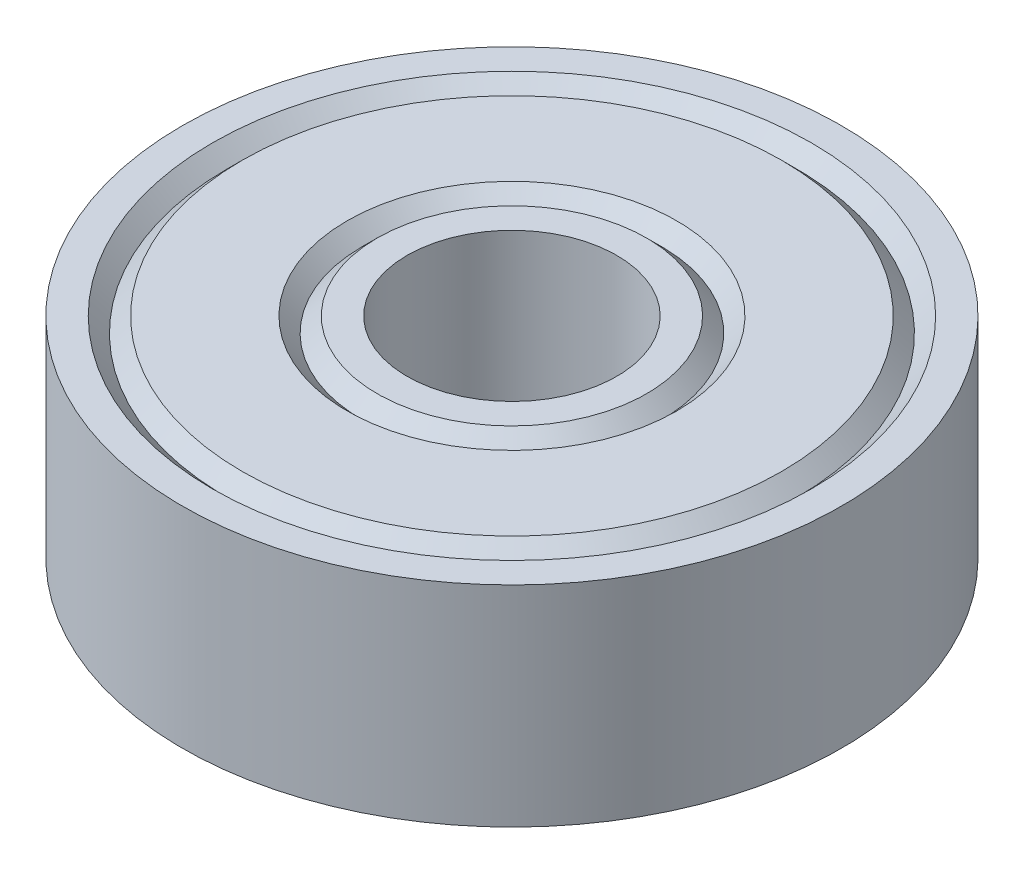
ISO-10303-21;
HEADER;
FILE_DESCRIPTION(('STEP AP214'),'2;1');
FILE_NAME('part.step','',(''),(''),'','','');
FILE_SCHEMA(('AUTOMOTIVE_DESIGN { 1 0 10303 214 1 1 1 1 }'));
ENDSEC;
DATA;
#1=APPLICATION_CONTEXT('core data for automotive mechanical design processes');
#2=APPLICATION_PROTOCOL_DEFINITION('international standard','automotive_design',2000,#1);
#3=PRODUCT_CONTEXT('',#1,'mechanical');
#4=PRODUCT('Part','Part','',(#3));
#5=PRODUCT_RELATED_PRODUCT_CATEGORY('part','',(#4));
#6=PRODUCT_DEFINITION_FORMATION('','',#4);
#7=PRODUCT_DEFINITION_CONTEXT('part definition',#1,'design');
#8=PRODUCT_DEFINITION('design','',#6,#7);
#9=PRODUCT_DEFINITION_SHAPE('','',#8);
#10=(LENGTH_UNIT() NAMED_UNIT(*) SI_UNIT(.MILLI.,.METRE.));
#11=(NAMED_UNIT(*) PLANE_ANGLE_UNIT() SI_UNIT($,.RADIAN.));
#12=(NAMED_UNIT(*) SI_UNIT($,.STERADIAN.) SOLID_ANGLE_UNIT());
#13=UNCERTAINTY_MEASURE_WITH_UNIT(LENGTH_MEASURE(1.E-05),#10,'distance_accuracy_value','');
#14=(GEOMETRIC_REPRESENTATION_CONTEXT(3) GLOBAL_UNCERTAINTY_ASSIGNED_CONTEXT((#13)) GLOBAL_UNIT_ASSIGNED_CONTEXT((#10,
#11,#12)) REPRESENTATION_CONTEXT('',''));
#15=CARTESIAN_POINT('',(0.,0.,0.));
#16=DIRECTION('',(0.,0.,1.));
#17=DIRECTION('',(1.,0.,0.));
#18=AXIS2_PLACEMENT_3D('',#15,#16,#17);
#19=CARTESIAN_POINT('',(0.,3.5,0.));
#20=DIRECTION('',(0.,1.,0.));
#21=DIRECTION('',(-1.,0.,0.));
#22=AXIS2_PLACEMENT_3D('',#19,#20,#21);
#23=CYLINDRICAL_SURFACE('',#22,3.5);
#24=CARTESIAN_POINT('',(0.,3.50000000000001,0.));
#25=DIRECTION('',(0.,1.,0.));
#26=DIRECTION('',(-1.,0.,0.));
#27=AXIS2_PLACEMENT_3D('',#24,#25,#26);
#28=CIRCLE('',#27,3.5);
#29=CARTESIAN_POINT('',(-3.5,3.5,0.));
#30=VERTEX_POINT('',#29);
#31=EDGE_CURVE('E83',#30,#30,#28,.T.);
#32=ORIENTED_EDGE('',*,*,#31,.T.);
#33=EDGE_LOOP('',(#32));
#34=FACE_BOUND('',#33,.T.);
#35=CARTESIAN_POINT('',(0.,-3.5,0.));
#36=DIRECTION('',(0.,1.,0.));
#37=DIRECTION('',(-1.,0.,0.));
#38=AXIS2_PLACEMENT_3D('',#35,#36,#37);
#39=CIRCLE('',#38,3.5);
#40=CARTESIAN_POINT('',(-3.5,-3.5,0.));
#41=VERTEX_POINT('',#40);
#42=EDGE_CURVE('E10',#41,#41,#39,.T.);
#43=ORIENTED_EDGE('',*,*,#42,.F.);
#44=EDGE_LOOP('',(#43));
#45=FACE_BOUND('',#44,.T.);
#46=ADVANCED_FACE('F31',(#34,#45),#23,.F.);
#47=CARTESIAN_POINT('',(-3.5,-3.5,0.));
#48=DIRECTION('',(0.,-1.,0.));
#49=DIRECTION('',(1.,0.,0.));
#50=AXIS2_PLACEMENT_3D('',#47,#48,#49);
#51=PLANE('',#50);
#52=ORIENTED_EDGE('',*,*,#42,.T.);
#53=EDGE_LOOP('',(#52));
#54=FACE_BOUND('',#53,.T.);
#55=CARTESIAN_POINT('',(0.,-3.5,0.));
#56=DIRECTION('',(0.,1.,0.));
#57=DIRECTION('',(-1.,0.,0.));
#58=AXIS2_PLACEMENT_3D('',#55,#56,#57);
#59=CIRCLE('',#58,4.5);
#60=CARTESIAN_POINT('',(-4.5,-3.5,0.));
#61=VERTEX_POINT('',#60);
#62=EDGE_CURVE('E37',#61,#61,#59,.T.);
#63=ORIENTED_EDGE('',*,*,#62,.F.);
#64=EDGE_LOOP('',(#63));
#65=FACE_BOUND('',#64,.T.);
#66=ADVANCED_FACE('F101',(#54,#65),#51,.T.);
#67=CARTESIAN_POINT('',(0.,-3.,0.));
#68=DIRECTION('',(0.,1.,0.));
#69=DIRECTION('',(-1.,0.,0.));
#70=AXIS2_PLACEMENT_3D('',#67,#68,#69);
#71=CONICAL_SURFACE('',#70,5.,0.785398163397448);
#72=ORIENTED_EDGE('',*,*,#62,.T.);
#73=EDGE_LOOP('',(#72));
#74=FACE_BOUND('',#73,.T.);
#75=CARTESIAN_POINT('',(0.,-3.,0.));
#76=DIRECTION('',(0.,1.,0.));
#77=DIRECTION('',(-1.,0.,0.));
#78=AXIS2_PLACEMENT_3D('',#75,#76,#77);
#79=CIRCLE('',#78,5.);
#80=CARTESIAN_POINT('',(-5.,-3.,0.));
#81=VERTEX_POINT('',#80);
#82=EDGE_CURVE('E41',#81,#81,#79,.T.);
#83=ORIENTED_EDGE('',*,*,#82,.F.);
#84=EDGE_LOOP('',(#83));
#85=FACE_BOUND('',#84,.T.);
#86=ADVANCED_FACE('F105',(#74,#85),#71,.T.);
#87=CARTESIAN_POINT('',(0.,-3.5,0.));
#88=DIRECTION('',(0.,-1.,0.));
#89=DIRECTION('',(1.,0.,0.));
#90=AXIS2_PLACEMENT_3D('',#87,#88,#89);
#91=CONICAL_SURFACE('',#90,5.5,0.785398163397448);
#92=ORIENTED_EDGE('',*,*,#82,.T.);
#93=EDGE_LOOP('',(#92));
#94=FACE_BOUND('',#93,.T.);
#95=CARTESIAN_POINT('',(0.,-3.5,0.));
#96=DIRECTION('',(0.,1.,0.));
#97=DIRECTION('',(-1.,0.,0.));
#98=AXIS2_PLACEMENT_3D('',#95,#96,#97);
#99=CIRCLE('',#98,5.5);
#100=CARTESIAN_POINT('',(-5.5,-3.5,0.));
#101=VERTEX_POINT('',#100);
#102=EDGE_CURVE('E45',#101,#101,#99,.T.);
#103=ORIENTED_EDGE('',*,*,#102,.F.);
#104=EDGE_LOOP('',(#103));
#105=FACE_BOUND('',#104,.T.);
#106=ADVANCED_FACE('F109',(#94,#105),#91,.F.);
#107=CARTESIAN_POINT('',(-5.5,-3.5,0.));
#108=DIRECTION('',(0.,-1.,0.));
#109=DIRECTION('',(1.,0.,0.));
#110=AXIS2_PLACEMENT_3D('',#107,#108,#109);
#111=PLANE('',#110);
#112=ORIENTED_EDGE('',*,*,#102,.T.);
#113=EDGE_LOOP('',(#112));
#114=FACE_BOUND('',#113,.T.);
#115=CARTESIAN_POINT('',(0.,-3.5,0.));
#116=DIRECTION('',(0.,1.,0.));
#117=DIRECTION('',(-1.,0.,0.));
#118=AXIS2_PLACEMENT_3D('',#115,#116,#117);
#119=CIRCLE('',#118,8.99999999999999);
#120=CARTESIAN_POINT('',(-8.99999999999999,-3.50000000000001,0.));
#121=VERTEX_POINT('',#120);
#122=EDGE_CURVE('E50',#121,#121,#119,.T.);
#123=ORIENTED_EDGE('',*,*,#122,.F.);
#124=EDGE_LOOP('',(#123));
#125=FACE_BOUND('',#124,.T.);
#126=ADVANCED_FACE('F115',(#114,#125),#111,.T.);
#127=CARTESIAN_POINT('',(0.,-3.,0.));
#128=DIRECTION('',(0.,1.,0.));
#129=DIRECTION('',(-1.,0.,0.));
#130=AXIS2_PLACEMENT_3D('',#127,#128,#129);
#131=CONICAL_SURFACE('',#130,9.5,0.785398163397449);
#132=ORIENTED_EDGE('',*,*,#122,.T.);
#133=EDGE_LOOP('',(#132));
#134=FACE_BOUND('',#133,.T.);
#135=CARTESIAN_POINT('',(0.,-3.,0.));
#136=DIRECTION('',(0.,1.,0.));
#137=DIRECTION('',(-1.,0.,0.));
#138=AXIS2_PLACEMENT_3D('',#135,#136,#137);
#139=CIRCLE('',#138,9.5);
#140=CARTESIAN_POINT('',(-9.5,-3.,0.));
#141=VERTEX_POINT('',#140);
#142=EDGE_CURVE('E53',#141,#141,#139,.T.);
#143=ORIENTED_EDGE('',*,*,#142,.F.);
#144=EDGE_LOOP('',(#143));
#145=FACE_BOUND('',#144,.T.);
#146=ADVANCED_FACE('F119',(#134,#145),#131,.T.);
#147=CARTESIAN_POINT('',(0.,-3.5,0.));
#148=DIRECTION('',(0.,-1.,0.));
#149=DIRECTION('',(1.,0.,0.));
#150=AXIS2_PLACEMENT_3D('',#147,#148,#149);
#151=CONICAL_SURFACE('',#150,10.,0.785398163397447);
#152=ORIENTED_EDGE('',*,*,#142,.T.);
#153=EDGE_LOOP('',(#152));
#154=FACE_BOUND('',#153,.T.);
#155=CARTESIAN_POINT('',(0.,-3.5,0.));
#156=DIRECTION('',(0.,1.,0.));
#157=DIRECTION('',(-1.,0.,0.));
#158=AXIS2_PLACEMENT_3D('',#155,#156,#157);
#159=CIRCLE('',#158,10.);
#160=CARTESIAN_POINT('',(-10.,-3.5,0.));
#161=VERTEX_POINT('',#160);
#162=EDGE_CURVE('E56',#161,#161,#159,.T.);
#163=ORIENTED_EDGE('',*,*,#162,.F.);
#164=EDGE_LOOP('',(#163));
#165=FACE_BOUND('',#164,.T.);
#166=ADVANCED_FACE('F123',(#154,#165),#151,.F.);
#167=CARTESIAN_POINT('',(-10.,-3.5,0.));
#168=DIRECTION('',(0.,-1.,0.));
#169=DIRECTION('',(1.,0.,0.));
#170=AXIS2_PLACEMENT_3D('',#167,#168,#169);
#171=PLANE('',#170);
#172=ORIENTED_EDGE('',*,*,#162,.T.);
#173=EDGE_LOOP('',(#172));
#174=FACE_BOUND('',#173,.T.);
#175=CARTESIAN_POINT('',(0.,-3.5,0.));
#176=DIRECTION('',(0.,1.,0.));
#177=DIRECTION('',(-1.,0.,0.));
#178=AXIS2_PLACEMENT_3D('',#175,#176,#177);
#179=CIRCLE('',#178,11.);
#180=CARTESIAN_POINT('',(-11.,-3.5,0.));
#181=VERTEX_POINT('',#180);
#182=EDGE_CURVE('E59',#181,#181,#179,.T.);
#183=ORIENTED_EDGE('',*,*,#182,.F.);
#184=EDGE_LOOP('',(#183));
#185=FACE_BOUND('',#184,.T.);
#186=ADVANCED_FACE('F127',(#174,#185),#171,.T.);
#187=CARTESIAN_POINT('',(0.,3.5,0.));
#188=DIRECTION('',(0.,1.,0.));
#189=DIRECTION('',(-1.,0.,0.));
#190=AXIS2_PLACEMENT_3D('',#187,#188,#189);
#191=CYLINDRICAL_SURFACE('',#190,11.);
#192=ORIENTED_EDGE('',*,*,#182,.T.);
#193=EDGE_LOOP('',(#192));
#194=FACE_BOUND('',#193,.T.);
#195=CARTESIAN_POINT('',(0.,3.5,0.));
#196=DIRECTION('',(0.,1.,0.));
#197=DIRECTION('',(-1.,0.,0.));
#198=AXIS2_PLACEMENT_3D('',#195,#196,#197);
#199=CIRCLE('',#198,11.);
#200=CARTESIAN_POINT('',(-11.,3.5,0.));
#201=VERTEX_POINT('',#200);
#202=EDGE_CURVE('E62',#201,#201,#199,.T.);
#203=ORIENTED_EDGE('',*,*,#202,.F.);
#204=EDGE_LOOP('',(#203));
#205=FACE_BOUND('',#204,.T.);
#206=ADVANCED_FACE('F131',(#194,#205),#191,.T.);
#207=CARTESIAN_POINT('',(-10.,3.5,0.));
#208=DIRECTION('',(0.,1.,0.));
#209=DIRECTION('',(-1.,0.,0.));
#210=AXIS2_PLACEMENT_3D('',#207,#208,#209);
#211=PLANE('',#210);
#212=ORIENTED_EDGE('',*,*,#202,.T.);
#213=EDGE_LOOP('',(#212));
#214=FACE_BOUND('',#213,.T.);
#215=CARTESIAN_POINT('',(0.,3.5,0.));
#216=DIRECTION('',(0.,1.,0.));
#217=DIRECTION('',(-1.,0.,0.));
#218=AXIS2_PLACEMENT_3D('',#215,#216,#217);
#219=CIRCLE('',#218,10.);
#220=CARTESIAN_POINT('',(-10.,3.5,0.));
#221=VERTEX_POINT('',#220);
#222=EDGE_CURVE('E65',#221,#221,#219,.T.);
#223=ORIENTED_EDGE('',*,*,#222,.F.);
#224=EDGE_LOOP('',(#223));
#225=FACE_BOUND('',#224,.T.);
#226=ADVANCED_FACE('F135',(#214,#225),#211,.T.);
#227=CARTESIAN_POINT('',(0.,3.,0.));
#228=DIRECTION('',(0.,1.,0.));
#229=DIRECTION('',(-1.,0.,0.));
#230=AXIS2_PLACEMENT_3D('',#227,#228,#229);
#231=CONICAL_SURFACE('',#230,9.5,0.785398163397447);
#232=ORIENTED_EDGE('',*,*,#222,.T.);
#233=EDGE_LOOP('',(#232));
#234=FACE_BOUND('',#233,.T.);
#235=CARTESIAN_POINT('',(0.,3.,0.));
#236=DIRECTION('',(0.,1.,0.));
#237=DIRECTION('',(-1.,0.,0.));
#238=AXIS2_PLACEMENT_3D('',#235,#236,#237);
#239=CIRCLE('',#238,9.5);
#240=CARTESIAN_POINT('',(-9.5,3.,0.));
#241=VERTEX_POINT('',#240);
#242=EDGE_CURVE('E68',#241,#241,#239,.T.);
#243=ORIENTED_EDGE('',*,*,#242,.F.);
#244=EDGE_LOOP('',(#243));
#245=FACE_BOUND('',#244,.T.);
#246=ADVANCED_FACE('F139',(#234,#245),#231,.F.);
#247=CARTESIAN_POINT('',(0.,3.50000000000001,0.));
#248=DIRECTION('',(0.,-1.,0.));
#249=DIRECTION('',(1.,0.,0.));
#250=AXIS2_PLACEMENT_3D('',#247,#248,#249);
#251=CONICAL_SURFACE('',#250,8.99999999999999,0.785398163397449);
#252=ORIENTED_EDGE('',*,*,#242,.T.);
#253=EDGE_LOOP('',(#252));
#254=FACE_BOUND('',#253,.T.);
#255=CARTESIAN_POINT('',(0.,3.50000000000001,0.));
#256=DIRECTION('',(0.,1.,0.));
#257=DIRECTION('',(-1.,0.,0.));
#258=AXIS2_PLACEMENT_3D('',#255,#256,#257);
#259=CIRCLE('',#258,8.99999999999999);
#260=CARTESIAN_POINT('',(-8.99999999999999,3.50000000000001,0.));
#261=VERTEX_POINT('',#260);
#262=EDGE_CURVE('E71',#261,#261,#259,.T.);
#263=ORIENTED_EDGE('',*,*,#262,.F.);
#264=EDGE_LOOP('',(#263));
#265=FACE_BOUND('',#264,.T.);
#266=ADVANCED_FACE('F143',(#254,#265),#251,.T.);
#267=CARTESIAN_POINT('',(-5.5,3.5,0.));
#268=DIRECTION('',(0.,1.,0.));
#269=DIRECTION('',(-1.,0.,0.));
#270=AXIS2_PLACEMENT_3D('',#267,#268,#269);
#271=PLANE('',#270);
#272=ORIENTED_EDGE('',*,*,#262,.T.);
#273=EDGE_LOOP('',(#272));
#274=FACE_BOUND('',#273,.T.);
#275=CARTESIAN_POINT('',(0.,3.5,0.));
#276=DIRECTION('',(0.,1.,0.));
#277=DIRECTION('',(-1.,0.,0.));
#278=AXIS2_PLACEMENT_3D('',#275,#276,#277);
#279=CIRCLE('',#278,5.5);
#280=CARTESIAN_POINT('',(-5.5,3.5,0.));
#281=VERTEX_POINT('',#280);
#282=EDGE_CURVE('E74',#281,#281,#279,.T.);
#283=ORIENTED_EDGE('',*,*,#282,.F.);
#284=EDGE_LOOP('',(#283));
#285=FACE_BOUND('',#284,.T.);
#286=ADVANCED_FACE('F147',(#274,#285),#271,.T.);
#287=CARTESIAN_POINT('',(0.,3.,0.));
#288=DIRECTION('',(0.,1.,0.));
#289=DIRECTION('',(-1.,0.,0.));
#290=AXIS2_PLACEMENT_3D('',#287,#288,#289);
#291=CONICAL_SURFACE('',#290,5.,0.785398163397447);
#292=ORIENTED_EDGE('',*,*,#282,.T.);
#293=EDGE_LOOP('',(#292));
#294=FACE_BOUND('',#293,.T.);
#295=CARTESIAN_POINT('',(0.,3.,0.));
#296=DIRECTION('',(0.,1.,0.));
#297=DIRECTION('',(-1.,0.,0.));
#298=AXIS2_PLACEMENT_3D('',#295,#296,#297);
#299=CIRCLE('',#298,5.);
#300=CARTESIAN_POINT('',(-5.,3.,0.));
#301=VERTEX_POINT('',#300);
#302=EDGE_CURVE('E77',#301,#301,#299,.T.);
#303=ORIENTED_EDGE('',*,*,#302,.F.);
#304=EDGE_LOOP('',(#303));
#305=FACE_BOUND('',#304,.T.);
#306=ADVANCED_FACE('F97',(#294,#305),#291,.F.);
#307=CARTESIAN_POINT('',(0.,3.5,0.));
#308=DIRECTION('',(0.,-1.,0.));
#309=DIRECTION('',(1.,0.,0.));
#310=AXIS2_PLACEMENT_3D('',#307,#308,#309);
#311=CONICAL_SURFACE('',#310,4.5,0.785398163397448);
#312=ORIENTED_EDGE('',*,*,#302,.T.);
#313=EDGE_LOOP('',(#312));
#314=FACE_BOUND('',#313,.T.);
#315=CARTESIAN_POINT('',(0.,3.5,0.));
#316=DIRECTION('',(0.,1.,0.));
#317=DIRECTION('',(-1.,0.,0.));
#318=AXIS2_PLACEMENT_3D('',#315,#316,#317);
#319=CIRCLE('',#318,4.5);
#320=CARTESIAN_POINT('',(-4.5,3.5,0.));
#321=VERTEX_POINT('',#320);
#322=EDGE_CURVE('E80',#321,#321,#319,.T.);
#323=ORIENTED_EDGE('',*,*,#322,.F.);
#324=EDGE_LOOP('',(#323));
#325=FACE_BOUND('',#324,.T.);
#326=ADVANCED_FACE('F91',(#314,#325),#311,.T.);
#327=CARTESIAN_POINT('',(-3.5,3.5,0.));
#328=DIRECTION('',(0.,1.,0.));
#329=DIRECTION('',(-1.,0.,0.));
#330=AXIS2_PLACEMENT_3D('',#327,#328,#329);
#331=PLANE('',#330);
#332=ORIENTED_EDGE('',*,*,#322,.T.);
#333=EDGE_LOOP('',(#332));
#334=FACE_BOUND('',#333,.T.);
#335=ORIENTED_EDGE('',*,*,#31,.F.);
#336=EDGE_LOOP('',(#335));
#337=FACE_BOUND('',#336,.T.);
#338=ADVANCED_FACE('F89',(#334,#337),#331,.T.);
#339=CLOSED_SHELL('',(#46,#66,#86,#106,#126,#146,#166,#186,#206,#226,#246,#266,#286,#306,#326,#338));
#340=MANIFOLD_SOLID_BREP('B2',#339);
#341=ADVANCED_BREP_SHAPE_REPRESENTATION('',(#18,#340),#14);
#342=SHAPE_DEFINITION_REPRESENTATION(#9,#341);
ENDSEC;
END-ISO-10303-21;
